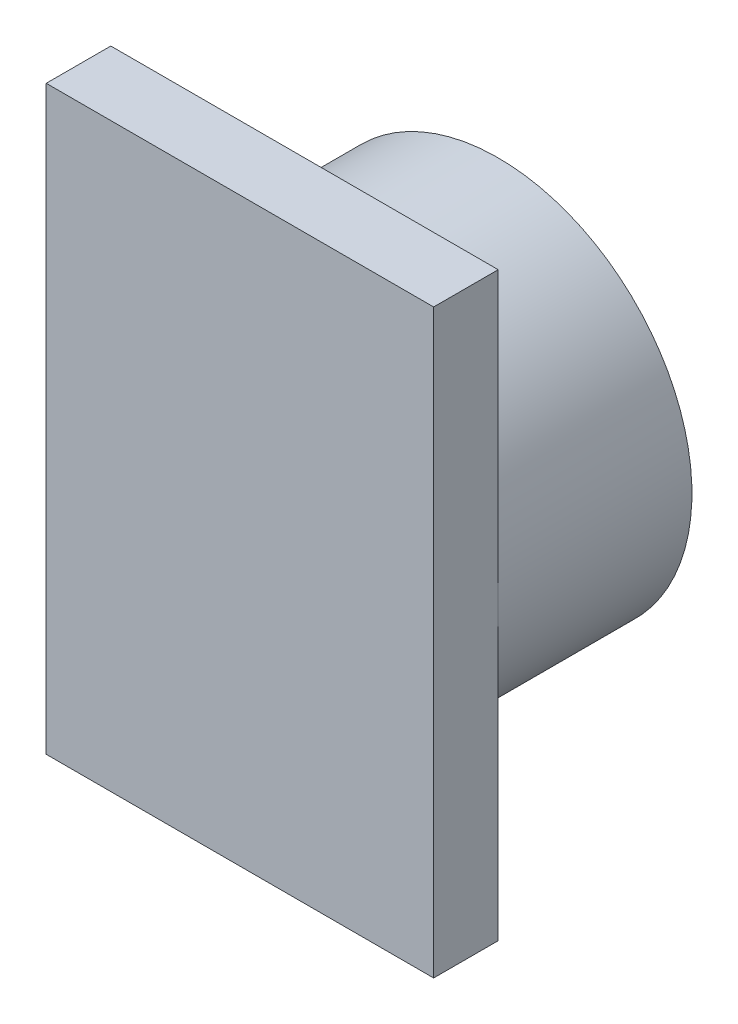
ISO-10303-21;
HEADER;
FILE_DESCRIPTION(('STEP AP214'),'2;1');
FILE_NAME('part.step','',(''),(''),'','','');
FILE_SCHEMA(('AUTOMOTIVE_DESIGN { 1 0 10303 214 1 1 1 1 }'));
ENDSEC;
DATA;
#1=APPLICATION_CONTEXT('core data for automotive mechanical design processes');
#2=APPLICATION_PROTOCOL_DEFINITION('international standard','automotive_design',2000,#1);
#3=PRODUCT_CONTEXT('',#1,'mechanical');
#4=PRODUCT('Part','Part','',(#3));
#5=PRODUCT_RELATED_PRODUCT_CATEGORY('part','',(#4));
#6=PRODUCT_DEFINITION_FORMATION('','',#4);
#7=PRODUCT_DEFINITION_CONTEXT('part definition',#1,'design');
#8=PRODUCT_DEFINITION('design','',#6,#7);
#9=PRODUCT_DEFINITION_SHAPE('','',#8);
#10=(LENGTH_UNIT() NAMED_UNIT(*) SI_UNIT(.MILLI.,.METRE.));
#11=(NAMED_UNIT(*) PLANE_ANGLE_UNIT() SI_UNIT($,.RADIAN.));
#12=(NAMED_UNIT(*) SI_UNIT($,.STERADIAN.) SOLID_ANGLE_UNIT());
#13=UNCERTAINTY_MEASURE_WITH_UNIT(LENGTH_MEASURE(1.E-05),#10,'distance_accuracy_value','');
#14=(GEOMETRIC_REPRESENTATION_CONTEXT(3) GLOBAL_UNCERTAINTY_ASSIGNED_CONTEXT((#13)) GLOBAL_UNIT_ASSIGNED_CONTEXT((#10,
#11,#12)) REPRESENTATION_CONTEXT('',''));
#15=CARTESIAN_POINT('',(0.,0.,0.));
#16=DIRECTION('',(0.,0.,1.));
#17=DIRECTION('',(1.,0.,0.));
#18=AXIS2_PLACEMENT_3D('',#15,#16,#17);
#19=CARTESIAN_POINT('',(0.,0.,0.));
#20=DIRECTION('',(0.,0.,-1.));
#21=DIRECTION('',(-1.,0.,0.));
#22=AXIS2_PLACEMENT_3D('',#19,#20,#21);
#23=PLANE('',#22);
#24=CARTESIAN_POINT('',(0.,0.,0.));
#25=DIRECTION('',(0.,0.,-1.));
#26=DIRECTION('',(-1.,0.,0.));
#27=AXIS2_PLACEMENT_3D('',#24,#25,#26);
#28=CIRCLE('',#27,30.);
#29=CARTESIAN_POINT('',(-30.,0.,0.));
#30=VERTEX_POINT('',#29);
#31=CARTESIAN_POINT('',(30.,0.,0.));
#32=VERTEX_POINT('',#31);
#33=EDGE_CURVE('E47',#30,#32,#28,.T.);
#34=ORIENTED_EDGE('',*,*,#33,.F.);
#35=DIRECTION('',(0.,-1.,0.));
#36=VECTOR('',#35,1.);
#37=CARTESIAN_POINT('',(-30.,-45.,0.));
#38=LINE('',#37,#36);
#39=CARTESIAN_POINT('',(-30.,45.,0.));
#40=VERTEX_POINT('',#39);
#41=EDGE_CURVE('E170',#40,#30,#38,.T.);
#42=ORIENTED_EDGE('',*,*,#41,.F.);
#43=DIRECTION('',(-1.,0.,0.));
#44=VECTOR('',#43,1.);
#45=CARTESIAN_POINT('',(-30.,45.,0.));
#46=LINE('',#45,#44);
#47=CARTESIAN_POINT('',(30.,45.,0.));
#48=VERTEX_POINT('',#47);
#49=EDGE_CURVE('E167',#48,#40,#46,.T.);
#50=ORIENTED_EDGE('',*,*,#49,.F.);
#51=DIRECTION('',(0.,1.,0.));
#52=VECTOR('',#51,1.);
#53=CARTESIAN_POINT('',(30.,-45.,0.));
#54=LINE('',#53,#52);
#55=EDGE_CURVE('E150',#32,#48,#54,.T.);
#56=ORIENTED_EDGE('',*,*,#55,.F.);
#57=EDGE_LOOP('',(#34,#42,#50,#56));
#58=FACE_BOUND('',#57,.T.);
#59=ADVANCED_FACE('F37',(#58),#23,.T.);
#60=CARTESIAN_POINT('',(30.,-45.,10.));
#61=DIRECTION('',(-1.,0.,0.));
#62=DIRECTION('',(0.,0.,1.));
#63=AXIS2_PLACEMENT_3D('',#60,#61,#62);
#64=PLANE('',#63);
#65=CARTESIAN_POINT('',(30.,-45.,0.));
#66=VERTEX_POINT('',#65);
#67=EDGE_CURVE('E164',#66,#32,#54,.T.);
#68=ORIENTED_EDGE('',*,*,#67,.T.);
#69=ORIENTED_EDGE('',*,*,#55,.T.);
#70=DIRECTION('',(0.,0.,-1.));
#71=VECTOR('',#70,1.);
#72=CARTESIAN_POINT('',(30.,45.,10.));
#73=LINE('',#72,#71);
#74=CARTESIAN_POINT('',(30.,45.,10.));
#75=VERTEX_POINT('',#74);
#76=EDGE_CURVE('E41',#75,#48,#73,.T.);
#77=ORIENTED_EDGE('',*,*,#76,.F.);
#78=DIRECTION('',(0.,1.,0.));
#79=VECTOR('',#78,1.);
#80=CARTESIAN_POINT('',(30.,-45.,10.));
#81=LINE('',#80,#79);
#82=CARTESIAN_POINT('',(30.,-45.,10.));
#83=VERTEX_POINT('',#82);
#84=EDGE_CURVE('E153',#83,#75,#81,.T.);
#85=ORIENTED_EDGE('',*,*,#84,.F.);
#86=DIRECTION('',(0.,0.,-1.));
#87=VECTOR('',#86,1.);
#88=CARTESIAN_POINT('',(30.,-45.,10.));
#89=LINE('',#88,#87);
#90=EDGE_CURVE('E163',#83,#66,#89,.T.);
#91=ORIENTED_EDGE('',*,*,#90,.T.);
#92=EDGE_LOOP('',(#68,#69,#77,#85,#91));
#93=FACE_BOUND('',#92,.T.);
#94=ADVANCED_FACE('F39',(#93),#64,.F.);
#95=CARTESIAN_POINT('',(-30.,45.,10.));
#96=DIRECTION('',(0.,-1.,0.));
#97=DIRECTION('',(0.,0.,-1.));
#98=AXIS2_PLACEMENT_3D('',#95,#96,#97);
#99=PLANE('',#98);
#100=ORIENTED_EDGE('',*,*,#49,.T.);
#101=DIRECTION('',(0.,0.,-1.));
#102=VECTOR('',#101,1.);
#103=CARTESIAN_POINT('',(-30.,45.,10.));
#104=LINE('',#103,#102);
#105=CARTESIAN_POINT('',(-30.,45.,10.));
#106=VERTEX_POINT('',#105);
#107=EDGE_CURVE('E177',#106,#40,#104,.T.);
#108=ORIENTED_EDGE('',*,*,#107,.F.);
#109=DIRECTION('',(-1.,0.,0.));
#110=VECTOR('',#109,1.);
#111=CARTESIAN_POINT('',(-30.,45.,10.));
#112=LINE('',#111,#110);
#113=EDGE_CURVE('E156',#75,#106,#112,.T.);
#114=ORIENTED_EDGE('',*,*,#113,.F.);
#115=ORIENTED_EDGE('',*,*,#76,.T.);
#116=EDGE_LOOP('',(#100,#108,#114,#115));
#117=FACE_BOUND('',#116,.T.);
#118=ADVANCED_FACE('F186',(#117),#99,.F.);
#119=CARTESIAN_POINT('',(-30.,-45.,10.));
#120=DIRECTION('',(1.,0.,0.));
#121=DIRECTION('',(0.,0.,-1.));
#122=AXIS2_PLACEMENT_3D('',#119,#120,#121);
#123=PLANE('',#122);
#124=ORIENTED_EDGE('',*,*,#41,.T.);
#125=CARTESIAN_POINT('',(-30.,-45.,0.));
#126=VERTEX_POINT('',#125);
#127=EDGE_CURVE('E169',#30,#126,#38,.T.);
#128=ORIENTED_EDGE('',*,*,#127,.T.);
#129=DIRECTION('',(0.,0.,-1.));
#130=VECTOR('',#129,1.);
#131=CARTESIAN_POINT('',(-30.,-45.,10.));
#132=LINE('',#131,#130);
#133=CARTESIAN_POINT('',(-30.,-45.,10.));
#134=VERTEX_POINT('',#133);
#135=EDGE_CURVE('E175',#134,#126,#132,.T.);
#136=ORIENTED_EDGE('',*,*,#135,.F.);
#137=DIRECTION('',(0.,-1.,0.));
#138=VECTOR('',#137,1.);
#139=CARTESIAN_POINT('',(-30.,-45.,10.));
#140=LINE('',#139,#138);
#141=EDGE_CURVE('E159',#106,#134,#140,.T.);
#142=ORIENTED_EDGE('',*,*,#141,.F.);
#143=ORIENTED_EDGE('',*,*,#107,.T.);
#144=EDGE_LOOP('',(#124,#128,#136,#142,#143));
#145=FACE_BOUND('',#144,.T.);
#146=ADVANCED_FACE('F192',(#145),#123,.F.);
#147=CARTESIAN_POINT('',(-30.,-45.,10.));
#148=DIRECTION('',(0.,1.,0.));
#149=DIRECTION('',(0.,0.,1.));
#150=AXIS2_PLACEMENT_3D('',#147,#148,#149);
#151=PLANE('',#150);
#152=DIRECTION('',(1.,0.,0.));
#153=VECTOR('',#152,1.);
#154=CARTESIAN_POINT('',(-30.,-45.,0.));
#155=LINE('',#154,#153);
#156=EDGE_CURVE('E157',#126,#66,#155,.T.);
#157=ORIENTED_EDGE('',*,*,#156,.T.);
#158=ORIENTED_EDGE('',*,*,#90,.F.);
#159=DIRECTION('',(1.,0.,0.));
#160=VECTOR('',#159,1.);
#161=CARTESIAN_POINT('',(-30.,-45.,10.));
#162=LINE('',#161,#160);
#163=EDGE_CURVE('E161',#134,#83,#162,.T.);
#164=ORIENTED_EDGE('',*,*,#163,.F.);
#165=ORIENTED_EDGE('',*,*,#135,.T.);
#166=EDGE_LOOP('',(#157,#158,#164,#165));
#167=FACE_BOUND('',#166,.T.);
#168=ADVANCED_FACE('F198',(#167),#151,.F.);
#169=CARTESIAN_POINT('',(0.,0.,10.));
#170=DIRECTION('',(0.,0.,-1.));
#171=DIRECTION('',(-1.,0.,0.));
#172=AXIS2_PLACEMENT_3D('',#169,#170,#171);
#173=PLANE('',#172);
#174=ORIENTED_EDGE('',*,*,#84,.T.);
#175=ORIENTED_EDGE('',*,*,#113,.T.);
#176=ORIENTED_EDGE('',*,*,#141,.T.);
#177=ORIENTED_EDGE('',*,*,#163,.T.);
#178=EDGE_LOOP('',(#174,#175,#176,#177));
#179=FACE_BOUND('',#178,.T.);
#180=ADVANCED_FACE('F201',(#179),#173,.F.);
#181=EDGE_CURVE('E11',#32,#30,#28,.T.);
#182=ORIENTED_EDGE('',*,*,#181,.F.);
#183=ORIENTED_EDGE('',*,*,#67,.F.);
#184=ORIENTED_EDGE('',*,*,#156,.F.);
#185=ORIENTED_EDGE('',*,*,#127,.F.);
#186=EDGE_LOOP('',(#182,#183,#184,#185));
#187=FACE_BOUND('',#186,.T.);
#188=ADVANCED_FACE('F195',(#187),#23,.T.);
#189=CARTESIAN_POINT('',(0.,0.,-30.));
#190=DIRECTION('',(0.,0.,-1.));
#191=DIRECTION('',(-1.,0.,0.));
#192=AXIS2_PLACEMENT_3D('',#189,#190,#191);
#193=PLANE('',#192);
#194=CARTESIAN_POINT('',(0.,0.,-30.));
#195=DIRECTION('',(0.,0.,-1.));
#196=DIRECTION('',(-1.,0.,0.));
#197=AXIS2_PLACEMENT_3D('',#194,#195,#196);
#198=CIRCLE('',#197,30.);
#199=CARTESIAN_POINT('',(-30.,0.,-30.));
#200=VERTEX_POINT('',#199);
#201=EDGE_CURVE('E148',#200,#200,#198,.T.);
#202=ORIENTED_EDGE('',*,*,#201,.T.);
#203=EDGE_LOOP('',(#202));
#204=FACE_BOUND('',#203,.T.);
#205=DIRECTION('',(0.,1.,0.));
#206=VECTOR('',#205,1.);
#207=CARTESIAN_POINT('',(-4.,-13.9126853865912,-30.));
#208=LINE('',#207,#206);
#209=CARTESIAN_POINT('',(-4.,-16.9126853865912,-30.));
#210=VERTEX_POINT('',#209);
#211=CARTESIAN_POINT('',(-4.,-13.3252697783673,-30.));
#212=VERTEX_POINT('',#211);
#213=EDGE_CURVE('E130',#210,#212,#208,.T.);
#214=ORIENTED_EDGE('',*,*,#213,.F.);
#215=DIRECTION('',(-1.,0.,0.));
#216=VECTOR('',#215,1.);
#217=CARTESIAN_POINT('',(4.,-16.9126853865912,-30.));
#218=LINE('',#217,#216);
#219=CARTESIAN_POINT('',(4.,-16.9126853865912,-30.));
#220=VERTEX_POINT('',#219);
#221=EDGE_CURVE('E121',#220,#210,#218,.T.);
#222=ORIENTED_EDGE('',*,*,#221,.F.);
#223=DIRECTION('',(0.,-1.,0.));
#224=VECTOR('',#223,1.);
#225=CARTESIAN_POINT('',(4.,-13.9126853865912,-30.));
#226=LINE('',#225,#224);
#227=CARTESIAN_POINT('',(4.,-13.3252697783673,-30.));
#228=VERTEX_POINT('',#227);
#229=EDGE_CURVE('E111',#228,#220,#226,.T.);
#230=ORIENTED_EDGE('',*,*,#229,.F.);
#231=CARTESIAN_POINT('',(0.,0.,-30.));
#232=DIRECTION('',(0.,0.,-1.));
#233=DIRECTION('',(-1.,0.,0.));
#234=AXIS2_PLACEMENT_3D('',#231,#232,#233);
#235=CIRCLE('',#234,13.9126853865912);
#236=EDGE_CURVE('E132',#212,#228,#235,.T.);
#237=ORIENTED_EDGE('',*,*,#236,.F.);
#238=EDGE_LOOP('',(#214,#222,#230,#237));
#239=FACE_BOUND('',#238,.T.);
#240=ADVANCED_FACE('F129',(#204,#239),#193,.T.);
#241=CARTESIAN_POINT('',(0.,0.,-30.));
#242=DIRECTION('',(0.,0.,1.));
#243=DIRECTION('',(1.,0.,0.));
#244=AXIS2_PLACEMENT_3D('',#241,#242,#243);
#245=CYLINDRICAL_SURFACE('',#244,30.);
#246=ORIENTED_EDGE('',*,*,#201,.F.);
#247=EDGE_LOOP('',(#246));
#248=FACE_BOUND('',#247,.T.);
#249=ORIENTED_EDGE('',*,*,#33,.T.);
#250=ORIENTED_EDGE('',*,*,#181,.T.);
#251=EDGE_LOOP('',(#249,#250));
#252=FACE_BOUND('',#251,.T.);
#253=ADVANCED_FACE('F235',(#248,#252),#245,.T.);
#254=CARTESIAN_POINT('',(4.,-16.9126853865912,-30.));
#255=DIRECTION('',(0.,1.,0.));
#256=DIRECTION('',(0.,0.,1.));
#257=AXIS2_PLACEMENT_3D('',#254,#255,#256);
#258=PLANE('',#257);
#259=DIRECTION('',(-1.,0.,0.));
#260=VECTOR('',#259,1.);
#261=CARTESIAN_POINT('',(4.,-16.9126853865912,0.));
#262=LINE('',#261,#260);
#263=CARTESIAN_POINT('',(4.,-16.9126853865912,0.));
#264=VERTEX_POINT('',#263);
#265=CARTESIAN_POINT('',(-4.,-16.9126853865912,0.));
#266=VERTEX_POINT('',#265);
#267=EDGE_CURVE('E54',#264,#266,#262,.T.);
#268=ORIENTED_EDGE('',*,*,#267,.F.);
#269=DIRECTION('',(0.,0.,1.));
#270=VECTOR('',#269,1.);
#271=CARTESIAN_POINT('',(4.,-16.9126853865912,-30.));
#272=LINE('',#271,#270);
#273=EDGE_CURVE('E114',#220,#264,#272,.T.);
#274=ORIENTED_EDGE('',*,*,#273,.F.);
#275=ORIENTED_EDGE('',*,*,#221,.T.);
#276=DIRECTION('',(0.,0.,1.));
#277=VECTOR('',#276,1.);
#278=CARTESIAN_POINT('',(-4.,-16.9126853865912,-30.));
#279=LINE('',#278,#277);
#280=EDGE_CURVE('E126',#210,#266,#279,.T.);
#281=ORIENTED_EDGE('',*,*,#280,.T.);
#282=EDGE_LOOP('',(#268,#274,#275,#281));
#283=FACE_BOUND('',#282,.T.);
#284=ADVANCED_FACE('F124',(#283),#258,.T.);
#285=CARTESIAN_POINT('',(-4.,-13.9126853865912,-30.));
#286=DIRECTION('',(1.,0.,0.));
#287=DIRECTION('',(0.,0.,-1.));
#288=AXIS2_PLACEMENT_3D('',#285,#286,#287);
#289=PLANE('',#288);
#290=DIRECTION('',(0.,1.,0.));
#291=VECTOR('',#290,1.);
#292=CARTESIAN_POINT('',(-4.,-13.9126853865912,0.));
#293=LINE('',#292,#291);
#294=CARTESIAN_POINT('',(-4.,-13.3252697783673,0.));
#295=VERTEX_POINT('',#294);
#296=EDGE_CURVE('E137',#266,#295,#293,.T.);
#297=ORIENTED_EDGE('',*,*,#296,.F.);
#298=ORIENTED_EDGE('',*,*,#280,.F.);
#299=ORIENTED_EDGE('',*,*,#213,.T.);
#300=DIRECTION('',(0.,0.,1.));
#301=VECTOR('',#300,1.);
#302=CARTESIAN_POINT('',(-4.,-13.3252697783673,-30.));
#303=LINE('',#302,#301);
#304=EDGE_CURVE('E145',#212,#295,#303,.T.);
#305=ORIENTED_EDGE('',*,*,#304,.T.);
#306=EDGE_LOOP('',(#297,#298,#299,#305));
#307=FACE_BOUND('',#306,.T.);
#308=ADVANCED_FACE('F227',(#307),#289,.T.);
#309=CARTESIAN_POINT('',(0.,0.,-30.));
#310=DIRECTION('',(0.,0.,1.));
#311=DIRECTION('',(1.,0.,0.));
#312=AXIS2_PLACEMENT_3D('',#309,#310,#311);
#313=CYLINDRICAL_SURFACE('',#312,13.9126853865912);
#314=CARTESIAN_POINT('',(0.,0.,0.));
#315=DIRECTION('',(0.,0.,-1.));
#316=DIRECTION('',(-1.,0.,0.));
#317=AXIS2_PLACEMENT_3D('',#314,#315,#316);
#318=CIRCLE('',#317,13.9126853865912);
#319=CARTESIAN_POINT('',(4.,-13.3252697783673,0.));
#320=VERTEX_POINT('',#319);
#321=EDGE_CURVE('E140',#295,#320,#318,.T.);
#322=ORIENTED_EDGE('',*,*,#321,.F.);
#323=ORIENTED_EDGE('',*,*,#304,.F.);
#324=ORIENTED_EDGE('',*,*,#236,.T.);
#325=DIRECTION('',(0.,0.,1.));
#326=VECTOR('',#325,1.);
#327=CARTESIAN_POINT('',(4.,-13.3252697783673,-30.));
#328=LINE('',#327,#326);
#329=EDGE_CURVE('E116',#228,#320,#328,.T.);
#330=ORIENTED_EDGE('',*,*,#329,.T.);
#331=EDGE_LOOP('',(#322,#323,#324,#330));
#332=FACE_BOUND('',#331,.T.);
#333=ADVANCED_FACE('F221',(#332),#313,.F.);
#334=CARTESIAN_POINT('',(4.,-13.9126853865912,-30.));
#335=DIRECTION('',(-1.,0.,0.));
#336=DIRECTION('',(0.,0.,1.));
#337=AXIS2_PLACEMENT_3D('',#334,#335,#336);
#338=PLANE('',#337);
#339=DIRECTION('',(0.,-1.,0.));
#340=VECTOR('',#339,1.);
#341=CARTESIAN_POINT('',(4.,-13.9126853865912,0.));
#342=LINE('',#341,#340);
#343=EDGE_CURVE('E122',#320,#264,#342,.T.);
#344=ORIENTED_EDGE('',*,*,#343,.F.);
#345=ORIENTED_EDGE('',*,*,#329,.F.);
#346=ORIENTED_EDGE('',*,*,#229,.T.);
#347=ORIENTED_EDGE('',*,*,#273,.T.);
#348=EDGE_LOOP('',(#344,#345,#346,#347));
#349=FACE_BOUND('',#348,.T.);
#350=ADVANCED_FACE('F113',(#349),#338,.T.);
#351=ORIENTED_EDGE('',*,*,#343,.T.);
#352=ORIENTED_EDGE('',*,*,#267,.T.);
#353=ORIENTED_EDGE('',*,*,#296,.T.);
#354=ORIENTED_EDGE('',*,*,#321,.T.);
#355=EDGE_LOOP('',(#351,#352,#353,#354));
#356=FACE_BOUND('',#355,.T.);
#357=ADVANCED_FACE('F209',(#356),#23,.T.);
#358=CLOSED_SHELL('',(#59,#94,#118,#146,#168,#180,#188,#240,#253,#284,#308,#333,#350,#357));
#359=MANIFOLD_SOLID_BREP('B2',#358);
#360=ADVANCED_BREP_SHAPE_REPRESENTATION('',(#18,#359),#14);
#361=SHAPE_DEFINITION_REPRESENTATION(#9,#360);
ENDSEC;
END-ISO-10303-21;
